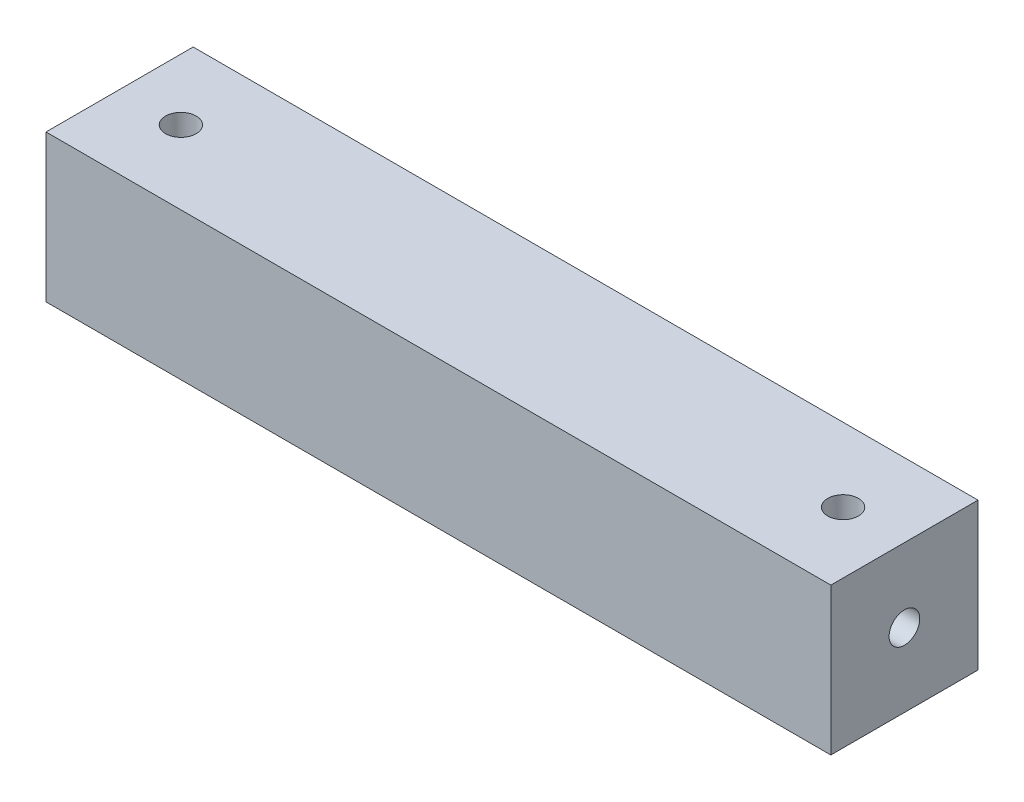
ISO-10303-21;
HEADER;
FILE_DESCRIPTION(('STEP AP214'),'2;1');
FILE_NAME('part.step','',(''),(''),'','','');
FILE_SCHEMA(('AUTOMOTIVE_DESIGN { 1 0 10303 214 1 1 1 1 }'));
ENDSEC;
DATA;
#1=APPLICATION_CONTEXT('core data for automotive mechanical design processes');
#2=APPLICATION_PROTOCOL_DEFINITION('international standard','automotive_design',2000,#1);
#3=PRODUCT_CONTEXT('',#1,'mechanical');
#4=PRODUCT('Part','Part','',(#3));
#5=PRODUCT_RELATED_PRODUCT_CATEGORY('part','',(#4));
#6=PRODUCT_DEFINITION_FORMATION('','',#4);
#7=PRODUCT_DEFINITION_CONTEXT('part definition',#1,'design');
#8=PRODUCT_DEFINITION('design','',#6,#7);
#9=PRODUCT_DEFINITION_SHAPE('','',#8);
#10=(LENGTH_UNIT() NAMED_UNIT(*) SI_UNIT(.MILLI.,.METRE.));
#11=(NAMED_UNIT(*) PLANE_ANGLE_UNIT() SI_UNIT($,.RADIAN.));
#12=(NAMED_UNIT(*) SI_UNIT($,.STERADIAN.) SOLID_ANGLE_UNIT());
#13=UNCERTAINTY_MEASURE_WITH_UNIT(LENGTH_MEASURE(1.E-05),#10,'distance_accuracy_value','');
#14=(GEOMETRIC_REPRESENTATION_CONTEXT(3) GLOBAL_UNCERTAINTY_ASSIGNED_CONTEXT((#13)) GLOBAL_UNIT_ASSIGNED_CONTEXT((#10,
#11,#12)) REPRESENTATION_CONTEXT('',''));
#15=CARTESIAN_POINT('',(0.,0.,0.));
#16=DIRECTION('',(0.,0.,1.));
#17=DIRECTION('',(1.,0.,0.));
#18=AXIS2_PLACEMENT_3D('',#15,#16,#17);
#19=CARTESIAN_POINT('',(0.,-3.,3.));
#20=DIRECTION('',(-1.,0.,0.));
#21=DIRECTION('',(0.,0.,1.));
#22=AXIS2_PLACEMENT_3D('',#19,#20,#21);
#23=CYLINDRICAL_SURFACE('',#22,0.625);
#24=CARTESIAN_POINT('',(-32.,-3.,3.));
#25=DIRECTION('',(-1.,0.,0.));
#26=DIRECTION('',(0.,0.,1.));
#27=AXIS2_PLACEMENT_3D('',#24,#25,#26);
#28=CIRCLE('',#27,0.625);
#29=CARTESIAN_POINT('',(-32.,-3.,3.625));
#30=VERTEX_POINT('',#29);
#31=EDGE_CURVE('E224',#30,#30,#28,.T.);
#32=ORIENTED_EDGE('',*,*,#31,.T.);
#33=EDGE_LOOP('',(#32));
#34=FACE_BOUND('',#33,.T.);
#35=CARTESIAN_POINT('',(-29.5,-3.,3.));
#36=DIRECTION('',(-0.707106781186547,0.707106781186547,0.));
#37=DIRECTION('',(-0.707106781186547,-0.707106781186547,0.));
#38=AXIS2_PLACEMENT_3D('',#35,#36,#37);
#39=ELLIPSE('',#38,0.883883476483186,0.625000000000001);
#40=CARTESIAN_POINT('',(-29.5,-3.,3.625));
#41=VERTEX_POINT('',#40);
#42=CARTESIAN_POINT('',(-29.5,-3.,2.375));
#43=VERTEX_POINT('',#42);
#44=EDGE_CURVE('E53',#41,#43,#39,.F.);
#45=ORIENTED_EDGE('',*,*,#44,.T.);
#46=CARTESIAN_POINT('',(-29.5,-3.,3.));
#47=DIRECTION('',(-0.707106781186547,-0.707106781186547,0.));
#48=DIRECTION('',(-0.707106781186547,0.707106781186547,0.));
#49=AXIS2_PLACEMENT_3D('',#46,#47,#48);
#50=ELLIPSE('',#49,0.883883476483186,0.625000000000001);
#51=EDGE_CURVE('E11',#43,#41,#50,.F.);
#52=ORIENTED_EDGE('',*,*,#51,.T.);
#53=EDGE_LOOP('',(#45,#52));
#54=FACE_BOUND('',#53,.T.);
#55=ADVANCED_FACE('F39',(#34,#54),#23,.F.);
#56=CARTESIAN_POINT('',(0.,-6.,6.));
#57=DIRECTION('',(-1.,0.,0.));
#58=DIRECTION('',(0.,-1.,0.));
#59=AXIS2_PLACEMENT_3D('',#56,#57,#58);
#60=PLANE('',#59);
#61=CARTESIAN_POINT('',(0.,-3.,3.));
#62=DIRECTION('',(-1.,0.,0.));
#63=DIRECTION('',(0.,0.,1.));
#64=AXIS2_PLACEMENT_3D('',#61,#62,#63);
#65=CIRCLE('',#64,0.625);
#66=CARTESIAN_POINT('',(0.,-3.,3.625));
#67=VERTEX_POINT('',#66);
#68=EDGE_CURVE('E227',#67,#67,#65,.T.);
#69=ORIENTED_EDGE('',*,*,#68,.T.);
#70=EDGE_LOOP('',(#69));
#71=FACE_BOUND('',#70,.T.);
#72=DIRECTION('',(0.,1.,0.));
#73=VECTOR('',#72,1.);
#74=CARTESIAN_POINT('',(0.,-6.,0.));
#75=LINE('',#74,#73);
#76=CARTESIAN_POINT('',(0.,-6.,0.));
#77=VERTEX_POINT('',#76);
#78=CARTESIAN_POINT('',(0.,0.,0.));
#79=VERTEX_POINT('',#78);
#80=EDGE_CURVE('E186',#77,#79,#75,.T.);
#81=ORIENTED_EDGE('',*,*,#80,.T.);
#82=DIRECTION('',(0.,0.,-1.));
#83=VECTOR('',#82,1.);
#84=CARTESIAN_POINT('',(0.,0.,6.));
#85=LINE('',#84,#83);
#86=CARTESIAN_POINT('',(0.,0.,6.));
#87=VERTEX_POINT('',#86);
#88=EDGE_CURVE('E105',#87,#79,#85,.T.);
#89=ORIENTED_EDGE('',*,*,#88,.F.);
#90=DIRECTION('',(0.,1.,0.));
#91=VECTOR('',#90,1.);
#92=CARTESIAN_POINT('',(0.,-6.,6.));
#93=LINE('',#92,#91);
#94=CARTESIAN_POINT('',(0.,-6.,6.));
#95=VERTEX_POINT('',#94);
#96=EDGE_CURVE('E200',#95,#87,#93,.T.);
#97=ORIENTED_EDGE('',*,*,#96,.F.);
#98=DIRECTION('',(0.,0.,-1.));
#99=VECTOR('',#98,1.);
#100=CARTESIAN_POINT('',(0.,-6.,6.));
#101=LINE('',#100,#99);
#102=EDGE_CURVE('E204',#95,#77,#101,.T.);
#103=ORIENTED_EDGE('',*,*,#102,.T.);
#104=EDGE_LOOP('',(#81,#89,#97,#103));
#105=FACE_BOUND('',#104,.T.);
#106=ADVANCED_FACE('F41',(#71,#105),#60,.F.);
#107=CARTESIAN_POINT('',(0.,0.,6.));
#108=DIRECTION('',(0.,-1.,0.));
#109=DIRECTION('',(1.,0.,0.));
#110=AXIS2_PLACEMENT_3D('',#107,#108,#109);
#111=PLANE('',#110);
#112=CARTESIAN_POINT('',(-29.5,0.,3.));
#113=DIRECTION('',(0.,-1.,0.));
#114=DIRECTION('',(1.,0.,0.));
#115=AXIS2_PLACEMENT_3D('',#112,#113,#114);
#116=CIRCLE('',#115,0.625000000000002);
#117=CARTESIAN_POINT('',(-28.875,0.,3.));
#118=VERTEX_POINT('',#117);
#119=EDGE_CURVE('E170',#118,#118,#116,.T.);
#120=ORIENTED_EDGE('',*,*,#119,.T.);
#121=EDGE_LOOP('',(#120));
#122=FACE_BOUND('',#121,.T.);
#123=CARTESIAN_POINT('',(-2.5,0.,3.));
#124=DIRECTION('',(0.,-1.,0.));
#125=DIRECTION('',(1.,0.,0.));
#126=AXIS2_PLACEMENT_3D('',#123,#124,#125);
#127=CIRCLE('',#126,0.625);
#128=CARTESIAN_POINT('',(-1.875,0.,3.));
#129=VERTEX_POINT('',#128);
#130=EDGE_CURVE('E174',#129,#129,#127,.T.);
#131=ORIENTED_EDGE('',*,*,#130,.T.);
#132=EDGE_LOOP('',(#131));
#133=FACE_BOUND('',#132,.T.);
#134=DIRECTION('',(-1.,0.,0.));
#135=VECTOR('',#134,1.);
#136=CARTESIAN_POINT('',(0.,0.,0.));
#137=LINE('',#136,#135);
#138=CARTESIAN_POINT('',(-32.,0.,0.));
#139=VERTEX_POINT('',#138);
#140=EDGE_CURVE('E177',#79,#139,#137,.T.);
#141=ORIENTED_EDGE('',*,*,#140,.T.);
#142=DIRECTION('',(0.,0.,-1.));
#143=VECTOR('',#142,1.);
#144=CARTESIAN_POINT('',(-32.,0.,6.));
#145=LINE('',#144,#143);
#146=CARTESIAN_POINT('',(-32.,0.,6.));
#147=VERTEX_POINT('',#146);
#148=EDGE_CURVE('E179',#147,#139,#145,.T.);
#149=ORIENTED_EDGE('',*,*,#148,.F.);
#150=DIRECTION('',(-1.,0.,0.));
#151=VECTOR('',#150,1.);
#152=CARTESIAN_POINT('',(0.,0.,6.));
#153=LINE('',#152,#151);
#154=EDGE_CURVE('E216',#87,#147,#153,.T.);
#155=ORIENTED_EDGE('',*,*,#154,.F.);
#156=ORIENTED_EDGE('',*,*,#88,.T.);
#157=EDGE_LOOP('',(#141,#149,#155,#156));
#158=FACE_BOUND('',#157,.T.);
#159=ADVANCED_FACE('F134',(#122,#133,#158),#111,.F.);
#160=CARTESIAN_POINT('',(-32.,-6.,6.));
#161=DIRECTION('',(1.,0.,0.));
#162=DIRECTION('',(0.,0.,-1.));
#163=AXIS2_PLACEMENT_3D('',#160,#161,#162);
#164=PLANE('',#163);
#165=ORIENTED_EDGE('',*,*,#31,.F.);
#166=EDGE_LOOP('',(#165));
#167=FACE_BOUND('',#166,.T.);
#168=DIRECTION('',(0.,-1.,0.));
#169=VECTOR('',#168,1.);
#170=CARTESIAN_POINT('',(-32.,-6.,0.));
#171=LINE('',#170,#169);
#172=CARTESIAN_POINT('',(-32.,-6.,0.));
#173=VERTEX_POINT('',#172);
#174=EDGE_CURVE('E185',#139,#173,#171,.T.);
#175=ORIENTED_EDGE('',*,*,#174,.T.);
#176=DIRECTION('',(0.,0.,-1.));
#177=VECTOR('',#176,1.);
#178=CARTESIAN_POINT('',(-32.,-6.,6.));
#179=LINE('',#178,#177);
#180=CARTESIAN_POINT('',(-32.,-6.,6.));
#181=VERTEX_POINT('',#180);
#182=EDGE_CURVE('E193',#181,#173,#179,.T.);
#183=ORIENTED_EDGE('',*,*,#182,.F.);
#184=DIRECTION('',(0.,-1.,0.));
#185=VECTOR('',#184,1.);
#186=CARTESIAN_POINT('',(-32.,-6.,6.));
#187=LINE('',#186,#185);
#188=EDGE_CURVE('E191',#147,#181,#187,.T.);
#189=ORIENTED_EDGE('',*,*,#188,.F.);
#190=ORIENTED_EDGE('',*,*,#148,.T.);
#191=EDGE_LOOP('',(#175,#183,#189,#190));
#192=FACE_BOUND('',#191,.T.);
#193=ADVANCED_FACE('F159',(#167,#192),#164,.F.);
#194=CARTESIAN_POINT('',(0.,-6.,6.));
#195=DIRECTION('',(0.,1.,0.));
#196=DIRECTION('',(-1.,0.,0.));
#197=AXIS2_PLACEMENT_3D('',#194,#195,#196);
#198=PLANE('',#197);
#199=CARTESIAN_POINT('',(-29.5,-6.,3.));
#200=DIRECTION('',(0.,-1.,0.));
#201=DIRECTION('',(1.,0.,0.));
#202=AXIS2_PLACEMENT_3D('',#199,#200,#201);
#203=CIRCLE('',#202,0.625000000000002);
#204=CARTESIAN_POINT('',(-28.875,-6.,3.));
#205=VERTEX_POINT('',#204);
#206=EDGE_CURVE('E240',#205,#205,#203,.T.);
#207=ORIENTED_EDGE('',*,*,#206,.F.);
#208=EDGE_LOOP('',(#207));
#209=FACE_BOUND('',#208,.T.);
#210=CARTESIAN_POINT('',(-2.5,-6.,3.));
#211=DIRECTION('',(0.,-1.,0.));
#212=DIRECTION('',(1.,0.,0.));
#213=AXIS2_PLACEMENT_3D('',#210,#211,#212);
#214=CIRCLE('',#213,0.625);
#215=CARTESIAN_POINT('',(-1.875,-6.,3.));
#216=VERTEX_POINT('',#215);
#217=EDGE_CURVE('E234',#216,#216,#214,.T.);
#218=ORIENTED_EDGE('',*,*,#217,.F.);
#219=EDGE_LOOP('',(#218));
#220=FACE_BOUND('',#219,.T.);
#221=DIRECTION('',(1.,0.,0.));
#222=VECTOR('',#221,1.);
#223=CARTESIAN_POINT('',(0.,-6.,0.));
#224=LINE('',#223,#222);
#225=EDGE_CURVE('E196',#173,#77,#224,.T.);
#226=ORIENTED_EDGE('',*,*,#225,.T.);
#227=ORIENTED_EDGE('',*,*,#102,.F.);
#228=DIRECTION('',(1.,0.,0.));
#229=VECTOR('',#228,1.);
#230=CARTESIAN_POINT('',(0.,-6.,6.));
#231=LINE('',#230,#229);
#232=EDGE_CURVE('E208',#181,#95,#231,.T.);
#233=ORIENTED_EDGE('',*,*,#232,.F.);
#234=ORIENTED_EDGE('',*,*,#182,.T.);
#235=EDGE_LOOP('',(#226,#227,#233,#234));
#236=FACE_BOUND('',#235,.T.);
#237=ADVANCED_FACE('F153',(#209,#220,#236),#198,.F.);
#238=CARTESIAN_POINT('',(0.,0.,6.));
#239=DIRECTION('',(0.,0.,1.));
#240=DIRECTION('',(1.,0.,0.));
#241=AXIS2_PLACEMENT_3D('',#238,#239,#240);
#242=PLANE('',#241);
#243=ORIENTED_EDGE('',*,*,#96,.T.);
#244=ORIENTED_EDGE('',*,*,#154,.T.);
#245=ORIENTED_EDGE('',*,*,#188,.T.);
#246=ORIENTED_EDGE('',*,*,#232,.T.);
#247=EDGE_LOOP('',(#243,#244,#245,#246));
#248=FACE_BOUND('',#247,.T.);
#249=ADVANCED_FACE('F147',(#248),#242,.T.);
#250=CARTESIAN_POINT('',(0.,0.,0.));
#251=DIRECTION('',(0.,0.,1.));
#252=DIRECTION('',(1.,0.,0.));
#253=AXIS2_PLACEMENT_3D('',#250,#251,#252);
#254=PLANE('',#253);
#255=ORIENTED_EDGE('',*,*,#80,.F.);
#256=ORIENTED_EDGE('',*,*,#225,.F.);
#257=ORIENTED_EDGE('',*,*,#174,.F.);
#258=ORIENTED_EDGE('',*,*,#140,.F.);
#259=EDGE_LOOP('',(#255,#256,#257,#258));
#260=FACE_BOUND('',#259,.T.);
#261=ADVANCED_FACE('F141',(#260),#254,.F.);
#262=CARTESIAN_POINT('',(-2.5,-3.,3.));
#263=DIRECTION('',(-0.707106781186547,0.707106781186547,0.));
#264=DIRECTION('',(-0.707106781186547,-0.707106781186547,0.));
#265=AXIS2_PLACEMENT_3D('',#262,#263,#264);
#266=ELLIPSE('',#265,0.883883476483185,0.625);
#267=CARTESIAN_POINT('',(-2.5,-3.,3.625));
#268=VERTEX_POINT('',#267);
#269=CARTESIAN_POINT('',(-2.5,-3.,2.375));
#270=VERTEX_POINT('',#269);
#271=EDGE_CURVE('E94',#268,#270,#266,.T.);
#272=ORIENTED_EDGE('',*,*,#271,.T.);
#273=CARTESIAN_POINT('',(-2.5,-3.,3.));
#274=DIRECTION('',(-0.707106781186547,-0.707106781186547,0.));
#275=DIRECTION('',(-0.707106781186547,0.707106781186547,0.));
#276=AXIS2_PLACEMENT_3D('',#273,#274,#275);
#277=ELLIPSE('',#276,0.883883476483185,0.625);
#278=EDGE_CURVE('E100',#270,#268,#277,.T.);
#279=ORIENTED_EDGE('',*,*,#278,.T.);
#280=EDGE_LOOP('',(#272,#279));
#281=FACE_BOUND('',#280,.T.);
#282=ORIENTED_EDGE('',*,*,#68,.F.);
#283=EDGE_LOOP('',(#282));
#284=FACE_BOUND('',#283,.T.);
#285=ADVANCED_FACE('F110',(#281,#284),#23,.F.);
#286=CARTESIAN_POINT('',(-2.5,0.,3.));
#287=DIRECTION('',(0.,-1.,0.));
#288=DIRECTION('',(1.,0.,0.));
#289=AXIS2_PLACEMENT_3D('',#286,#287,#288);
#290=CYLINDRICAL_SURFACE('',#289,0.625);
#291=ORIENTED_EDGE('',*,*,#217,.T.);
#292=EDGE_LOOP('',(#291));
#293=FACE_BOUND('',#292,.T.);
#294=CARTESIAN_POINT('',(-2.5,-3.,3.));
#295=DIRECTION('',(-0.707106781186547,0.707106781186547,0.));
#296=DIRECTION('',(-0.707106781186547,-0.707106781186547,0.));
#297=AXIS2_PLACEMENT_3D('',#294,#295,#296);
#298=ELLIPSE('',#297,0.883883476483185,0.625);
#299=EDGE_CURVE('E60',#268,#270,#298,.F.);
#300=ORIENTED_EDGE('',*,*,#299,.F.);
#301=ORIENTED_EDGE('',*,*,#278,.F.);
#302=EDGE_LOOP('',(#300,#301));
#303=FACE_BOUND('',#302,.T.);
#304=ADVANCED_FACE('F103',(#293,#303),#290,.F.);
#305=ORIENTED_EDGE('',*,*,#130,.F.);
#306=EDGE_LOOP('',(#305));
#307=FACE_BOUND('',#306,.T.);
#308=ORIENTED_EDGE('',*,*,#271,.F.);
#309=CARTESIAN_POINT('',(-2.5,-3.,3.));
#310=DIRECTION('',(-0.707106781186547,-0.707106781186547,0.));
#311=DIRECTION('',(-0.707106781186547,0.707106781186547,0.));
#312=AXIS2_PLACEMENT_3D('',#309,#310,#311);
#313=ELLIPSE('',#312,0.883883476483185,0.625);
#314=EDGE_CURVE('E96',#270,#268,#313,.F.);
#315=ORIENTED_EDGE('',*,*,#314,.F.);
#316=EDGE_LOOP('',(#308,#315));
#317=FACE_BOUND('',#316,.T.);
#318=ADVANCED_FACE('F95',(#307,#317),#290,.F.);
#319=CARTESIAN_POINT('',(-29.5,0.,3.));
#320=DIRECTION('',(0.,-1.,0.));
#321=DIRECTION('',(1.,0.,0.));
#322=AXIS2_PLACEMENT_3D('',#319,#320,#321);
#323=CYLINDRICAL_SURFACE('',#322,0.625000000000002);
#324=ORIENTED_EDGE('',*,*,#206,.T.);
#325=EDGE_LOOP('',(#324));
#326=FACE_BOUND('',#325,.T.);
#327=ORIENTED_EDGE('',*,*,#44,.F.);
#328=CARTESIAN_POINT('',(-29.5,-3.,3.));
#329=DIRECTION('',(-0.707106781186547,-0.707106781186547,0.));
#330=DIRECTION('',(-0.707106781186547,0.707106781186547,0.));
#331=AXIS2_PLACEMENT_3D('',#328,#329,#330);
#332=ELLIPSE('',#331,0.883883476483186,0.625000000000001);
#333=EDGE_CURVE('E48',#43,#41,#332,.T.);
#334=ORIENTED_EDGE('',*,*,#333,.F.);
#335=EDGE_LOOP('',(#327,#334));
#336=FACE_BOUND('',#335,.T.);
#337=ADVANCED_FACE('F125',(#326,#336),#323,.F.);
#338=ORIENTED_EDGE('',*,*,#119,.F.);
#339=EDGE_LOOP('',(#338));
#340=FACE_BOUND('',#339,.T.);
#341=CARTESIAN_POINT('',(-29.5,-3.,3.));
#342=DIRECTION('',(-0.707106781186547,0.707106781186547,0.));
#343=DIRECTION('',(-0.707106781186547,-0.707106781186547,0.));
#344=AXIS2_PLACEMENT_3D('',#341,#342,#343);
#345=ELLIPSE('',#344,0.883883476483186,0.625000000000001);
#346=EDGE_CURVE('E117',#41,#43,#345,.T.);
#347=ORIENTED_EDGE('',*,*,#346,.F.);
#348=ORIENTED_EDGE('',*,*,#51,.F.);
#349=EDGE_LOOP('',(#347,#348));
#350=FACE_BOUND('',#349,.T.);
#351=ADVANCED_FACE('F127',(#340,#350),#323,.F.);
#352=ORIENTED_EDGE('',*,*,#346,.T.);
#353=ORIENTED_EDGE('',*,*,#333,.T.);
#354=EDGE_LOOP('',(#352,#353));
#355=FACE_BOUND('',#354,.T.);
#356=ORIENTED_EDGE('',*,*,#299,.T.);
#357=ORIENTED_EDGE('',*,*,#314,.T.);
#358=EDGE_LOOP('',(#356,#357));
#359=FACE_BOUND('',#358,.T.);
#360=ADVANCED_FACE('F107',(#355,#359),#23,.F.);
#361=CLOSED_SHELL('',(#55,#106,#159,#193,#237,#249,#261,#285,#304,#318,#337,#351,#360));
#362=MANIFOLD_SOLID_BREP('B2',#361);
#363=ADVANCED_BREP_SHAPE_REPRESENTATION('',(#18,#362),#14);
#364=SHAPE_DEFINITION_REPRESENTATION(#9,#363);
ENDSEC;
END-ISO-10303-21;
